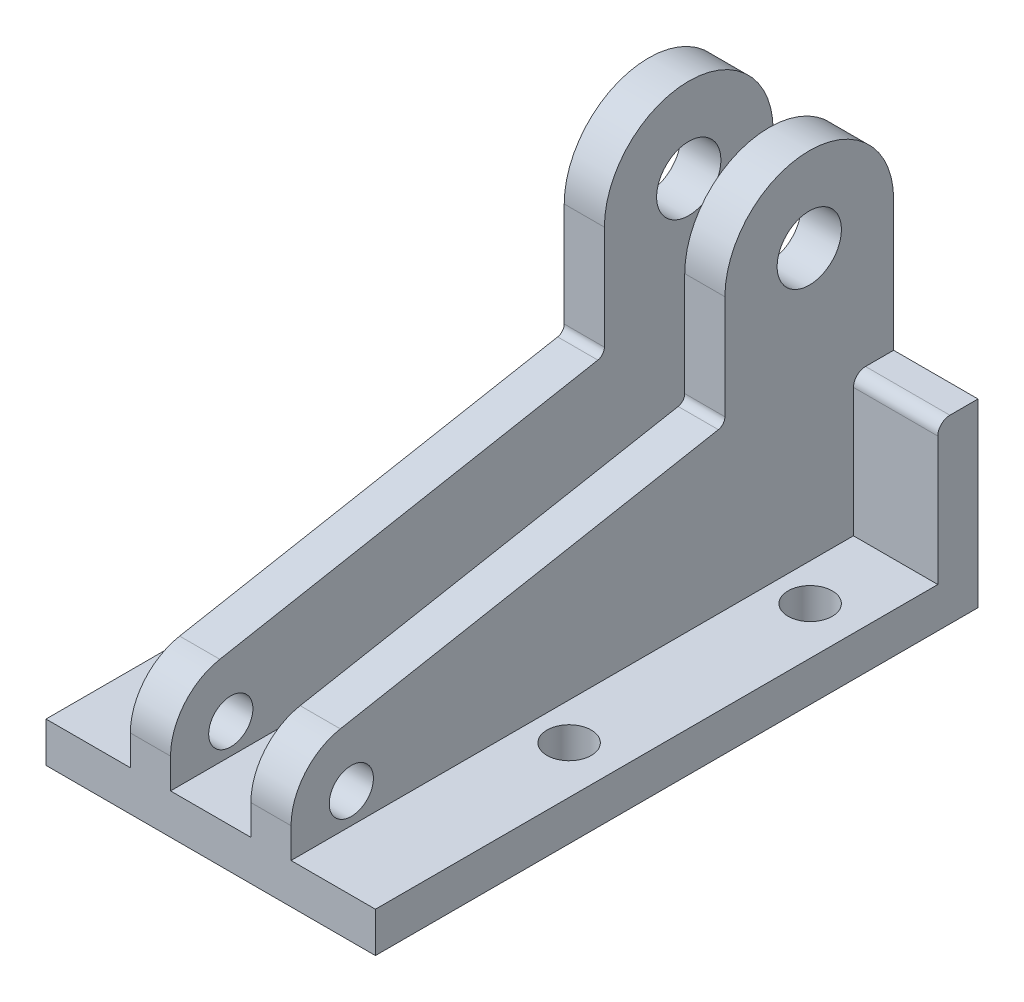
ISO-10303-21;
HEADER;
FILE_DESCRIPTION(('STEP AP214'),'2;1');
FILE_NAME('part.step','',(''),(''),'','','');
FILE_SCHEMA(('AUTOMOTIVE_DESIGN { 1 0 10303 214 1 1 1 1 }'));
ENDSEC;
DATA;
#1=APPLICATION_CONTEXT('core data for automotive mechanical design processes');
#2=APPLICATION_PROTOCOL_DEFINITION('international standard','automotive_design',2000,#1);
#3=PRODUCT_CONTEXT('',#1,'mechanical');
#4=PRODUCT('Part','Part','',(#3));
#5=PRODUCT_RELATED_PRODUCT_CATEGORY('part','',(#4));
#6=PRODUCT_DEFINITION_FORMATION('','',#4);
#7=PRODUCT_DEFINITION_CONTEXT('part definition',#1,'design');
#8=PRODUCT_DEFINITION('design','',#6,#7);
#9=PRODUCT_DEFINITION_SHAPE('','',#8);
#10=(LENGTH_UNIT() NAMED_UNIT(*) SI_UNIT(.MILLI.,.METRE.));
#11=(NAMED_UNIT(*) PLANE_ANGLE_UNIT() SI_UNIT($,.RADIAN.));
#12=(NAMED_UNIT(*) SI_UNIT($,.STERADIAN.) SOLID_ANGLE_UNIT());
#13=UNCERTAINTY_MEASURE_WITH_UNIT(LENGTH_MEASURE(1.E-05),#10,'distance_accuracy_value','');
#14=(GEOMETRIC_REPRESENTATION_CONTEXT(3) GLOBAL_UNCERTAINTY_ASSIGNED_CONTEXT((#13)) GLOBAL_UNIT_ASSIGNED_CONTEXT((#10,
#11,#12)) REPRESENTATION_CONTEXT('',''));
#15=CARTESIAN_POINT('',(0.,0.,0.));
#16=DIRECTION('',(0.,0.,1.));
#17=DIRECTION('',(1.,0.,0.));
#18=AXIS2_PLACEMENT_3D('',#15,#16,#17);
#19=CARTESIAN_POINT('',(-82.,10.,84.297520661157));
#20=DIRECTION('',(0.,1.,0.));
#21=DIRECTION('',(0.,0.,1.));
#22=AXIS2_PLACEMENT_3D('',#19,#20,#21);
#23=PLANE('',#22);
#24=DIRECTION('',(1.,0.,0.));
#25=VECTOR('',#24,1.);
#26=CARTESIAN_POINT('',(-82.,10.,84.297520661157));
#27=LINE('',#26,#25);
#28=CARTESIAN_POINT('',(-82.,10.,84.297520661157));
#29=VERTEX_POINT('',#28);
#30=CARTESIAN_POINT('',(-61.,10.,84.297520661157));
#31=VERTEX_POINT('',#30);
#32=EDGE_CURVE('E11',#29,#31,#27,.T.);
#33=ORIENTED_EDGE('',*,*,#32,.T.);
#34=DIRECTION('',(0.,0.,-1.));
#35=VECTOR('',#34,1.);
#36=CARTESIAN_POINT('',(-61.,10.,84.297520661157));
#37=LINE('',#36,#35);
#38=CARTESIAN_POINT('',(-61.,10.,-55.702479338843));
#39=VERTEX_POINT('',#38);
#40=EDGE_CURVE('E460',#31,#39,#37,.T.);
#41=ORIENTED_EDGE('',*,*,#40,.T.);
#42=DIRECTION('',(1.,0.,0.));
#43=VECTOR('',#42,1.);
#44=CARTESIAN_POINT('',(-82.,10.,-55.702479338843));
#45=LINE('',#44,#43);
#46=CARTESIAN_POINT('',(-82.,10.,-55.702479338843));
#47=VERTEX_POINT('',#46);
#48=EDGE_CURVE('E309',#47,#39,#45,.T.);
#49=ORIENTED_EDGE('',*,*,#48,.F.);
#50=DIRECTION('',(0.,0.,1.));
#51=VECTOR('',#50,1.);
#52=CARTESIAN_POINT('',(-82.,10.,84.297520661157));
#53=LINE('',#52,#51);
#54=EDGE_CURVE('E272',#47,#29,#53,.T.);
#55=ORIENTED_EDGE('',*,*,#54,.T.);
#56=EDGE_LOOP('',(#33,#41,#49,#55));
#57=FACE_BOUND('',#56,.T.);
#58=ADVANCED_FACE('F39',(#57),#23,.T.);
#59=CARTESIAN_POINT('',(-82.,10.,-55.702479338843));
#60=DIRECTION('',(0.,0.,1.));
#61=DIRECTION('',(1.,0.,0.));
#62=AXIS2_PLACEMENT_3D('',#59,#60,#61);
#63=PLANE('',#62);
#64=ORIENTED_EDGE('',*,*,#48,.T.);
#65=DIRECTION('',(0.,1.,0.));
#66=VECTOR('',#65,1.);
#67=CARTESIAN_POINT('',(-61.,10.,-55.702479338843));
#68=LINE('',#67,#66);
#69=CARTESIAN_POINT('',(-61.,42.,-55.702479338843));
#70=VERTEX_POINT('',#69);
#71=EDGE_CURVE('E463',#39,#70,#68,.T.);
#72=ORIENTED_EDGE('',*,*,#71,.T.);
#73=DIRECTION('',(1.,0.,0.));
#74=VECTOR('',#73,1.);
#75=CARTESIAN_POINT('',(-82.,42.,-55.702479338843));
#76=LINE('',#75,#74);
#77=CARTESIAN_POINT('',(-82.,42.,-55.702479338843));
#78=VERTEX_POINT('',#77);
#79=EDGE_CURVE('E313',#78,#70,#76,.T.);
#80=ORIENTED_EDGE('',*,*,#79,.F.);
#81=DIRECTION('',(0.,-1.,0.));
#82=VECTOR('',#81,1.);
#83=CARTESIAN_POINT('',(-82.,10.,-55.702479338843));
#84=LINE('',#83,#82);
#85=EDGE_CURVE('E277',#78,#47,#84,.T.);
#86=ORIENTED_EDGE('',*,*,#85,.T.);
#87=EDGE_LOOP('',(#64,#72,#80,#86));
#88=FACE_BOUND('',#87,.T.);
#89=ADVANCED_FACE('F535',(#88),#63,.T.);
#90=CARTESIAN_POINT('',(-82.,42.,-58.702479338843));
#91=DIRECTION('',(1.,0.,0.));
#92=DIRECTION('',(0.,0.,-1.));
#93=AXIS2_PLACEMENT_3D('',#90,#91,#92);
#94=CYLINDRICAL_SURFACE('',#93,3.);
#95=ORIENTED_EDGE('',*,*,#79,.T.);
#96=CARTESIAN_POINT('',(-61.,42.,-58.702479338843));
#97=DIRECTION('',(-1.,0.,0.));
#98=DIRECTION('',(0.,0.,1.));
#99=AXIS2_PLACEMENT_3D('',#96,#97,#98);
#100=CIRCLE('',#99,3.00000000000002);
#101=CARTESIAN_POINT('',(-61.,45.,-58.702479338843));
#102=VERTEX_POINT('',#101);
#103=EDGE_CURVE('E253',#70,#102,#100,.T.);
#104=ORIENTED_EDGE('',*,*,#103,.T.);
#105=DIRECTION('',(1.,0.,0.));
#106=VECTOR('',#105,1.);
#107=CARTESIAN_POINT('',(-82.,45.,-58.702479338843));
#108=LINE('',#107,#106);
#109=CARTESIAN_POINT('',(-82.,45.,-58.702479338843));
#110=VERTEX_POINT('',#109);
#111=EDGE_CURVE('E266',#110,#102,#108,.T.);
#112=ORIENTED_EDGE('',*,*,#111,.F.);
#113=CARTESIAN_POINT('',(-82.,42.,-58.702479338843));
#114=DIRECTION('',(1.,0.,0.));
#115=DIRECTION('',(0.,0.,-1.));
#116=AXIS2_PLACEMENT_3D('',#113,#114,#115);
#117=CIRCLE('',#116,3.);
#118=EDGE_CURVE('E282',#110,#78,#117,.T.);
#119=ORIENTED_EDGE('',*,*,#118,.T.);
#120=EDGE_LOOP('',(#95,#104,#112,#119));
#121=FACE_BOUND('',#120,.T.);
#122=ADVANCED_FACE('F388',(#121),#94,.T.);
#123=CARTESIAN_POINT('',(-82.,45.,-58.702479338843));
#124=DIRECTION('',(0.,1.,0.));
#125=DIRECTION('',(0.,0.,1.));
#126=AXIS2_PLACEMENT_3D('',#123,#124,#125);
#127=PLANE('',#126);
#128=ORIENTED_EDGE('',*,*,#111,.T.);
#129=DIRECTION('',(0.,0.,-1.));
#130=VECTOR('',#129,1.);
#131=CARTESIAN_POINT('',(-61.,45.,-65.702479338843));
#132=LINE('',#131,#130);
#133=CARTESIAN_POINT('',(-61.,45.,-65.702479338843));
#134=VERTEX_POINT('',#133);
#135=EDGE_CURVE('E395',#102,#134,#132,.T.);
#136=ORIENTED_EDGE('',*,*,#135,.T.);
#137=DIRECTION('',(1.,0.,0.));
#138=VECTOR('',#137,1.);
#139=CARTESIAN_POINT('',(-82.,45.,-65.702479338843));
#140=LINE('',#139,#138);
#141=CARTESIAN_POINT('',(-82.,45.,-65.702479338843));
#142=VERTEX_POINT('',#141);
#143=EDGE_CURVE('E259',#142,#134,#140,.T.);
#144=ORIENTED_EDGE('',*,*,#143,.F.);
#145=DIRECTION('',(0.,0.,1.));
#146=VECTOR('',#145,1.);
#147=CARTESIAN_POINT('',(-82.,45.,-58.702479338843));
#148=LINE('',#147,#146);
#149=EDGE_CURVE('E386',#142,#110,#148,.T.);
#150=ORIENTED_EDGE('',*,*,#149,.T.);
#151=EDGE_LOOP('',(#128,#136,#144,#150));
#152=FACE_BOUND('',#151,.T.);
#153=ADVANCED_FACE('F394',(#152),#127,.T.);
#154=CARTESIAN_POINT('',(-11.7768288178748,10.,24.297520661157));
#155=DIRECTION('',(0.,1.,0.));
#156=DIRECTION('',(0.,0.,1.));
#157=AXIS2_PLACEMENT_3D('',#154,#155,#156);
#158=CIRCLE('',#157,5.5);
#159=CARTESIAN_POINT('',(-11.7768288178748,10.,29.797520661157));
#160=VERTEX_POINT('',#159);
#161=EDGE_CURVE('E963',#160,#160,#158,.T.);
#162=ORIENTED_EDGE('',*,*,#161,.F.);
#163=EDGE_LOOP('',(#162));
#164=FACE_BOUND('',#163,.T.);
#165=CARTESIAN_POINT('',(-11.7768288178748,10.,-35.702479338843));
#166=DIRECTION('',(0.,1.,0.));
#167=DIRECTION('',(0.,0.,1.));
#168=AXIS2_PLACEMENT_3D('',#165,#166,#167);
#169=CIRCLE('',#168,5.5);
#170=CARTESIAN_POINT('',(-11.7768288178748,10.,-30.202479338843));
#171=VERTEX_POINT('',#170);
#172=EDGE_CURVE('E964',#171,#171,#169,.T.);
#173=ORIENTED_EDGE('',*,*,#172,.F.);
#174=EDGE_LOOP('',(#173));
#175=FACE_BOUND('',#174,.T.);
#176=CARTESIAN_POINT('',(-21.,10.,-55.702479338843));
#177=VERTEX_POINT('',#176);
#178=CARTESIAN_POINT('',(0.,10.,-55.702479338843));
#179=VERTEX_POINT('',#178);
#180=EDGE_CURVE('E312',#177,#179,#45,.T.);
#181=ORIENTED_EDGE('',*,*,#180,.F.);
#182=DIRECTION('',(0.,0.,-1.));
#183=VECTOR('',#182,1.);
#184=CARTESIAN_POINT('',(-21.,10.,84.297520661157));
#185=LINE('',#184,#183);
#186=CARTESIAN_POINT('',(-21.,10.,84.297520661157));
#187=VERTEX_POINT('',#186);
#188=EDGE_CURVE('E364',#187,#177,#185,.T.);
#189=ORIENTED_EDGE('',*,*,#188,.F.);
#190=CARTESIAN_POINT('',(0.,10.,84.297520661157));
#191=VERTEX_POINT('',#190);
#192=EDGE_CURVE('E50',#187,#191,#27,.T.);
#193=ORIENTED_EDGE('',*,*,#192,.T.);
#194=DIRECTION('',(0.,0.,1.));
#195=VECTOR('',#194,1.);
#196=CARTESIAN_POINT('',(0.,10.,84.297520661157));
#197=LINE('',#196,#195);
#198=EDGE_CURVE('E305',#179,#191,#197,.T.);
#199=ORIENTED_EDGE('',*,*,#198,.F.);
#200=EDGE_LOOP('',(#181,#189,#193,#199));
#201=FACE_BOUND('',#200,.T.);
#202=ADVANCED_FACE('F537',(#164,#175,#201),#23,.T.);
#203=CARTESIAN_POINT('',(-21.,42.,-55.702479338843));
#204=VERTEX_POINT('',#203);
#205=CARTESIAN_POINT('',(0.,42.,-55.702479338843));
#206=VERTEX_POINT('',#205);
#207=EDGE_CURVE('E316',#204,#206,#76,.T.);
#208=ORIENTED_EDGE('',*,*,#207,.F.);
#209=DIRECTION('',(0.,1.,0.));
#210=VECTOR('',#209,1.);
#211=CARTESIAN_POINT('',(-21.,10.,-55.702479338843));
#212=LINE('',#211,#210);
#213=EDGE_CURVE('E366',#177,#204,#212,.T.);
#214=ORIENTED_EDGE('',*,*,#213,.F.);
#215=ORIENTED_EDGE('',*,*,#180,.T.);
#216=DIRECTION('',(0.,-1.,0.));
#217=VECTOR('',#216,1.);
#218=CARTESIAN_POINT('',(0.,10.,-55.702479338843));
#219=LINE('',#218,#217);
#220=EDGE_CURVE('E302',#206,#179,#219,.T.);
#221=ORIENTED_EDGE('',*,*,#220,.F.);
#222=EDGE_LOOP('',(#208,#214,#215,#221));
#223=FACE_BOUND('',#222,.T.);
#224=ADVANCED_FACE('F543',(#223),#63,.T.);
#225=CARTESIAN_POINT('',(-21.,45.,-58.702479338843));
#226=VERTEX_POINT('',#225);
#227=CARTESIAN_POINT('',(0.,45.,-58.702479338843));
#228=VERTEX_POINT('',#227);
#229=EDGE_CURVE('E263',#226,#228,#108,.T.);
#230=ORIENTED_EDGE('',*,*,#229,.F.);
#231=CARTESIAN_POINT('',(-21.,42.,-58.702479338843));
#232=DIRECTION('',(-1.,0.,0.));
#233=DIRECTION('',(0.,0.,1.));
#234=AXIS2_PLACEMENT_3D('',#231,#232,#233);
#235=CIRCLE('',#234,3.00000000000002);
#236=EDGE_CURVE('E368',#204,#226,#235,.T.);
#237=ORIENTED_EDGE('',*,*,#236,.F.);
#238=ORIENTED_EDGE('',*,*,#207,.T.);
#239=CARTESIAN_POINT('',(0.,42.,-58.702479338843));
#240=DIRECTION('',(1.,0.,0.));
#241=DIRECTION('',(0.,0.,-1.));
#242=AXIS2_PLACEMENT_3D('',#239,#240,#241);
#243=CIRCLE('',#242,3.);
#244=EDGE_CURVE('E299',#228,#206,#243,.T.);
#245=ORIENTED_EDGE('',*,*,#244,.F.);
#246=EDGE_LOOP('',(#230,#237,#238,#245));
#247=FACE_BOUND('',#246,.T.);
#248=ADVANCED_FACE('F334',(#247),#94,.T.);
#249=CARTESIAN_POINT('',(-21.,45.,-65.702479338843));
#250=VERTEX_POINT('',#249);
#251=CARTESIAN_POINT('',(0.,45.,-65.702479338843));
#252=VERTEX_POINT('',#251);
#253=EDGE_CURVE('E260',#250,#252,#140,.T.);
#254=ORIENTED_EDGE('',*,*,#253,.F.);
#255=DIRECTION('',(0.,0.,-1.));
#256=VECTOR('',#255,1.);
#257=CARTESIAN_POINT('',(-21.,45.,-65.702479338843));
#258=LINE('',#257,#256);
#259=EDGE_CURVE('E65',#226,#250,#258,.T.);
#260=ORIENTED_EDGE('',*,*,#259,.F.);
#261=ORIENTED_EDGE('',*,*,#229,.T.);
#262=DIRECTION('',(0.,0.,1.));
#263=VECTOR('',#262,1.);
#264=CARTESIAN_POINT('',(0.,45.,-58.702479338843));
#265=LINE('',#264,#263);
#266=EDGE_CURVE('E296',#252,#228,#265,.T.);
#267=ORIENTED_EDGE('',*,*,#266,.F.);
#268=EDGE_LOOP('',(#254,#260,#261,#267));
#269=FACE_BOUND('',#268,.T.);
#270=ADVANCED_FACE('F333',(#269),#127,.T.);
#271=CARTESIAN_POINT('',(-82.,0.,84.297520661157));
#272=DIRECTION('',(0.,0.,1.));
#273=DIRECTION('',(1.,0.,0.));
#274=AXIS2_PLACEMENT_3D('',#271,#272,#273);
#275=PLANE('',#274);
#276=DIRECTION('',(0.,-1.,0.));
#277=VECTOR('',#276,1.);
#278=CARTESIAN_POINT('',(-31.,10.,84.297520661157));
#279=LINE('',#278,#277);
#280=CARTESIAN_POINT('',(-31.,17.5,84.297520661157));
#281=VERTEX_POINT('',#280);
#282=CARTESIAN_POINT('',(-31.,10.,84.297520661157));
#283=VERTEX_POINT('',#282);
#284=EDGE_CURVE('E419',#281,#283,#279,.T.);
#285=ORIENTED_EDGE('',*,*,#284,.T.);
#286=CARTESIAN_POINT('',(-51.,10.,84.297520661157));
#287=VERTEX_POINT('',#286);
#288=EDGE_CURVE('E48',#287,#283,#27,.T.);
#289=ORIENTED_EDGE('',*,*,#288,.F.);
#290=DIRECTION('',(0.,-1.,0.));
#291=VECTOR('',#290,1.);
#292=CARTESIAN_POINT('',(-51.,10.,84.297520661157));
#293=LINE('',#292,#291);
#294=CARTESIAN_POINT('',(-51.,17.5,84.297520661157));
#295=VERTEX_POINT('',#294);
#296=EDGE_CURVE('E441',#295,#287,#293,.T.);
#297=ORIENTED_EDGE('',*,*,#296,.F.);
#298=DIRECTION('',(-1.,0.,0.));
#299=VECTOR('',#298,1.);
#300=CARTESIAN_POINT('',(-51.,17.5,84.297520661157));
#301=LINE('',#300,#299);
#302=CARTESIAN_POINT('',(-61.,17.5,84.297520661157));
#303=VERTEX_POINT('',#302);
#304=EDGE_CURVE('E467',#295,#303,#301,.T.);
#305=ORIENTED_EDGE('',*,*,#304,.T.);
#306=DIRECTION('',(0.,-1.,0.));
#307=VECTOR('',#306,1.);
#308=CARTESIAN_POINT('',(-61.,10.,84.297520661157));
#309=LINE('',#308,#307);
#310=EDGE_CURVE('E458',#303,#31,#309,.T.);
#311=ORIENTED_EDGE('',*,*,#310,.T.);
#312=ORIENTED_EDGE('',*,*,#32,.F.);
#313=DIRECTION('',(0.,-1.,0.));
#314=VECTOR('',#313,1.);
#315=CARTESIAN_POINT('',(-82.,0.,84.297520661157));
#316=LINE('',#315,#314);
#317=CARTESIAN_POINT('',(-82.,0.,84.297520661157));
#318=VERTEX_POINT('',#317);
#319=EDGE_CURVE('E307',#29,#318,#316,.T.);
#320=ORIENTED_EDGE('',*,*,#319,.T.);
#321=DIRECTION('',(1.,0.,0.));
#322=VECTOR('',#321,1.);
#323=CARTESIAN_POINT('',(-82.,0.,84.297520661157));
#324=LINE('',#323,#322);
#325=CARTESIAN_POINT('',(0.,0.,84.297520661157));
#326=VERTEX_POINT('',#325);
#327=EDGE_CURVE('E43',#318,#326,#324,.T.);
#328=ORIENTED_EDGE('',*,*,#327,.T.);
#329=DIRECTION('',(0.,-1.,0.));
#330=VECTOR('',#329,1.);
#331=CARTESIAN_POINT('',(0.,0.,84.297520661157));
#332=LINE('',#331,#330);
#333=EDGE_CURVE('E286',#191,#326,#332,.T.);
#334=ORIENTED_EDGE('',*,*,#333,.F.);
#335=ORIENTED_EDGE('',*,*,#192,.F.);
#336=DIRECTION('',(0.,-1.,0.));
#337=VECTOR('',#336,1.);
#338=CARTESIAN_POINT('',(-21.,10.,84.297520661157));
#339=LINE('',#338,#337);
#340=CARTESIAN_POINT('',(-21.,17.5,84.297520661157));
#341=VERTEX_POINT('',#340);
#342=EDGE_CURVE('E362',#341,#187,#339,.T.);
#343=ORIENTED_EDGE('',*,*,#342,.F.);
#344=DIRECTION('',(1.,0.,0.));
#345=VECTOR('',#344,1.);
#346=CARTESIAN_POINT('',(-31.,17.5,84.297520661157));
#347=LINE('',#346,#345);
#348=EDGE_CURVE('E290',#281,#341,#347,.T.);
#349=ORIENTED_EDGE('',*,*,#348,.F.);
#350=EDGE_LOOP('',(#285,#289,#297,#305,#311,#312,#320,#328,#334,#335,#343,#349));
#351=FACE_BOUND('',#350,.T.);
#352=ADVANCED_FACE('F41',(#351),#275,.T.);
#353=DIRECTION('',(0.,0.,-1.));
#354=VECTOR('',#353,1.);
#355=CARTESIAN_POINT('',(-51.,10.,84.297520661157));
#356=LINE('',#355,#354);
#357=CARTESIAN_POINT('',(-51.,10.,-55.702479338843));
#358=VERTEX_POINT('',#357);
#359=EDGE_CURVE('E412',#287,#358,#356,.T.);
#360=ORIENTED_EDGE('',*,*,#359,.F.);
#361=ORIENTED_EDGE('',*,*,#288,.T.);
#362=DIRECTION('',(0.,0.,-1.));
#363=VECTOR('',#362,1.);
#364=CARTESIAN_POINT('',(-31.,10.,84.297520661157));
#365=LINE('',#364,#363);
#366=CARTESIAN_POINT('',(-31.,10.,-55.702479338843));
#367=VERTEX_POINT('',#366);
#368=EDGE_CURVE('E411',#283,#367,#365,.T.);
#369=ORIENTED_EDGE('',*,*,#368,.T.);
#370=EDGE_CURVE('E311',#358,#367,#45,.T.);
#371=ORIENTED_EDGE('',*,*,#370,.F.);
#372=EDGE_LOOP('',(#360,#361,#369,#371));
#373=FACE_BOUND('',#372,.T.);
#374=ADVANCED_FACE('F409',(#373),#23,.T.);
#375=DIRECTION('',(0.,1.,0.));
#376=VECTOR('',#375,1.);
#377=CARTESIAN_POINT('',(-51.,10.,-55.702479338843));
#378=LINE('',#377,#376);
#379=CARTESIAN_POINT('',(-51.,42.,-55.702479338843));
#380=VERTEX_POINT('',#379);
#381=EDGE_CURVE('E438',#358,#380,#378,.T.);
#382=ORIENTED_EDGE('',*,*,#381,.F.);
#383=ORIENTED_EDGE('',*,*,#370,.T.);
#384=DIRECTION('',(0.,1.,0.));
#385=VECTOR('',#384,1.);
#386=CARTESIAN_POINT('',(-31.,10.,-55.702479338843));
#387=LINE('',#386,#385);
#388=CARTESIAN_POINT('',(-31.,42.,-55.702479338843));
#389=VERTEX_POINT('',#388);
#390=EDGE_CURVE('E423',#367,#389,#387,.T.);
#391=ORIENTED_EDGE('',*,*,#390,.T.);
#392=EDGE_CURVE('E315',#380,#389,#76,.T.);
#393=ORIENTED_EDGE('',*,*,#392,.F.);
#394=EDGE_LOOP('',(#382,#383,#391,#393));
#395=FACE_BOUND('',#394,.T.);
#396=ADVANCED_FACE('F437',(#395),#63,.T.);
#397=CARTESIAN_POINT('',(-51.,42.,-58.702479338843));
#398=DIRECTION('',(-1.,0.,0.));
#399=DIRECTION('',(0.,0.,1.));
#400=AXIS2_PLACEMENT_3D('',#397,#398,#399);
#401=CIRCLE('',#400,3.00000000000002);
#402=CARTESIAN_POINT('',(-51.,45.,-58.702479338843));
#403=VERTEX_POINT('',#402);
#404=EDGE_CURVE('E250',#380,#403,#401,.T.);
#405=ORIENTED_EDGE('',*,*,#404,.F.);
#406=ORIENTED_EDGE('',*,*,#392,.T.);
#407=CARTESIAN_POINT('',(-31.,42.,-58.702479338843));
#408=DIRECTION('',(-1.,0.,0.));
#409=DIRECTION('',(0.,0.,1.));
#410=AXIS2_PLACEMENT_3D('',#407,#408,#409);
#411=CIRCLE('',#410,3.00000000000002);
#412=CARTESIAN_POINT('',(-31.,45.,-58.702479338843));
#413=VERTEX_POINT('',#412);
#414=EDGE_CURVE('E380',#389,#413,#411,.T.);
#415=ORIENTED_EDGE('',*,*,#414,.T.);
#416=EDGE_CURVE('E326',#403,#413,#108,.T.);
#417=ORIENTED_EDGE('',*,*,#416,.F.);
#418=EDGE_LOOP('',(#405,#406,#415,#417));
#419=FACE_BOUND('',#418,.T.);
#420=ADVANCED_FACE('F433',(#419),#94,.T.);
#421=DIRECTION('',(0.,0.,-1.));
#422=VECTOR('',#421,1.);
#423=CARTESIAN_POINT('',(-51.,45.,-65.702479338843));
#424=LINE('',#423,#422);
#425=CARTESIAN_POINT('',(-51.,45.,-65.702479338843));
#426=VERTEX_POINT('',#425);
#427=EDGE_CURVE('E245',#403,#426,#424,.T.);
#428=ORIENTED_EDGE('',*,*,#427,.F.);
#429=ORIENTED_EDGE('',*,*,#416,.T.);
#430=DIRECTION('',(0.,0.,-1.));
#431=VECTOR('',#430,1.);
#432=CARTESIAN_POINT('',(-31.,45.,-65.702479338843));
#433=LINE('',#432,#431);
#434=CARTESIAN_POINT('',(-31.,45.,-65.702479338843));
#435=VERTEX_POINT('',#434);
#436=EDGE_CURVE('E258',#413,#435,#433,.T.);
#437=ORIENTED_EDGE('',*,*,#436,.T.);
#438=EDGE_CURVE('E239',#426,#435,#140,.T.);
#439=ORIENTED_EDGE('',*,*,#438,.F.);
#440=EDGE_LOOP('',(#428,#429,#437,#439));
#441=FACE_BOUND('',#440,.T.);
#442=ADVANCED_FACE('F256',(#441),#127,.T.);
#443=CARTESIAN_POINT('',(-82.,0.,-65.702479338843));
#444=DIRECTION('',(0.,0.,-1.));
#445=DIRECTION('',(-1.,0.,0.));
#446=AXIS2_PLACEMENT_3D('',#443,#444,#445);
#447=PLANE('',#446);
#448=DIRECTION('',(0.,1.,0.));
#449=VECTOR('',#448,1.);
#450=CARTESIAN_POINT('',(-21.,45.,-65.702479338843));
#451=LINE('',#450,#449);
#452=CARTESIAN_POINT('',(-21.,77.5313941212426,-65.702479338843));
#453=VERTEX_POINT('',#452);
#454=EDGE_CURVE('E339',#250,#453,#451,.T.);
#455=ORIENTED_EDGE('',*,*,#454,.F.);
#456=ORIENTED_EDGE('',*,*,#253,.T.);
#457=DIRECTION('',(0.,1.,0.));
#458=VECTOR('',#457,1.);
#459=CARTESIAN_POINT('',(0.,0.,-65.702479338843));
#460=LINE('',#459,#458);
#461=CARTESIAN_POINT('',(0.,0.,-65.702479338843));
#462=VERTEX_POINT('',#461);
#463=EDGE_CURVE('E293',#462,#252,#460,.T.);
#464=ORIENTED_EDGE('',*,*,#463,.F.);
#465=DIRECTION('',(1.,0.,0.));
#466=VECTOR('',#465,1.);
#467=CARTESIAN_POINT('',(-82.,0.,-65.702479338843));
#468=LINE('',#467,#466);
#469=CARTESIAN_POINT('',(-82.,0.,-65.702479338843));
#470=VERTEX_POINT('',#469);
#471=EDGE_CURVE('E264',#470,#462,#468,.T.);
#472=ORIENTED_EDGE('',*,*,#471,.F.);
#473=DIRECTION('',(0.,1.,0.));
#474=VECTOR('',#473,1.);
#475=CARTESIAN_POINT('',(-82.,0.,-65.702479338843));
#476=LINE('',#475,#474);
#477=EDGE_CURVE('E384',#470,#142,#476,.T.);
#478=ORIENTED_EDGE('',*,*,#477,.T.);
#479=ORIENTED_EDGE('',*,*,#143,.T.);
#480=DIRECTION('',(0.,1.,0.));
#481=VECTOR('',#480,1.);
#482=CARTESIAN_POINT('',(-61.,45.,-65.702479338843));
#483=LINE('',#482,#481);
#484=CARTESIAN_POINT('',(-61.,77.5313941212426,-65.702479338843));
#485=VERTEX_POINT('',#484);
#486=EDGE_CURVE('E57',#134,#485,#483,.T.);
#487=ORIENTED_EDGE('',*,*,#486,.T.);
#488=DIRECTION('',(-1.,0.,0.));
#489=VECTOR('',#488,1.);
#490=CARTESIAN_POINT('',(-51.,77.5313941212426,-65.702479338843));
#491=LINE('',#490,#489);
#492=CARTESIAN_POINT('',(-51.,77.5313941212426,-65.702479338843));
#493=VERTEX_POINT('',#492);
#494=EDGE_CURVE('E242',#493,#485,#491,.T.);
#495=ORIENTED_EDGE('',*,*,#494,.F.);
#496=DIRECTION('',(0.,1.,0.));
#497=VECTOR('',#496,1.);
#498=CARTESIAN_POINT('',(-51.,45.,-65.702479338843));
#499=LINE('',#498,#497);
#500=EDGE_CURVE('E234',#426,#493,#499,.T.);
#501=ORIENTED_EDGE('',*,*,#500,.F.);
#502=ORIENTED_EDGE('',*,*,#438,.T.);
#503=DIRECTION('',(0.,1.,0.));
#504=VECTOR('',#503,1.);
#505=CARTESIAN_POINT('',(-31.,45.,-65.702479338843));
#506=LINE('',#505,#504);
#507=CARTESIAN_POINT('',(-31.,77.5313941212426,-65.702479338843));
#508=VERTEX_POINT('',#507);
#509=EDGE_CURVE('E495',#435,#508,#506,.T.);
#510=ORIENTED_EDGE('',*,*,#509,.T.);
#511=DIRECTION('',(1.,0.,0.));
#512=VECTOR('',#511,1.);
#513=CARTESIAN_POINT('',(-31.,77.5313941212426,-65.702479338843));
#514=LINE('',#513,#512);
#515=EDGE_CURVE('E340',#508,#453,#514,.T.);
#516=ORIENTED_EDGE('',*,*,#515,.T.);
#517=EDGE_LOOP('',(#455,#456,#464,#472,#478,#479,#487,#495,#501,#502,#510,#516));
#518=FACE_BOUND('',#517,.T.);
#519=ADVANCED_FACE('F236',(#518),#447,.T.);
#520=CARTESIAN_POINT('',(-82.,0.,84.297520661157));
#521=DIRECTION('',(0.,-1.,0.));
#522=DIRECTION('',(0.,0.,-1.));
#523=AXIS2_PLACEMENT_3D('',#520,#521,#522);
#524=PLANE('',#523);
#525=CARTESIAN_POINT('',(-11.7768288178748,0.,24.297520661157));
#526=DIRECTION('',(0.,1.,0.));
#527=DIRECTION('',(0.,0.,1.));
#528=AXIS2_PLACEMENT_3D('',#525,#526,#527);
#529=CIRCLE('',#528,5.5);
#530=CARTESIAN_POINT('',(-11.7768288178748,0.,29.797520661157));
#531=VERTEX_POINT('',#530);
#532=EDGE_CURVE('E960',#531,#531,#529,.T.);
#533=ORIENTED_EDGE('',*,*,#532,.T.);
#534=EDGE_LOOP('',(#533));
#535=FACE_BOUND('',#534,.T.);
#536=CARTESIAN_POINT('',(-11.7768288178748,0.,-35.702479338843));
#537=DIRECTION('',(0.,1.,0.));
#538=DIRECTION('',(0.,0.,1.));
#539=AXIS2_PLACEMENT_3D('',#536,#537,#538);
#540=CIRCLE('',#539,5.5);
#541=CARTESIAN_POINT('',(-11.7768288178748,0.,-30.202479338843));
#542=VERTEX_POINT('',#541);
#543=EDGE_CURVE('E969',#542,#542,#540,.T.);
#544=ORIENTED_EDGE('',*,*,#543,.T.);
#545=EDGE_LOOP('',(#544));
#546=FACE_BOUND('',#545,.T.);
#547=DIRECTION('',(0.,0.,-1.));
#548=VECTOR('',#547,1.);
#549=CARTESIAN_POINT('',(0.,0.,84.297520661157));
#550=LINE('',#549,#548);
#551=EDGE_CURVE('E289',#326,#462,#550,.T.);
#552=ORIENTED_EDGE('',*,*,#551,.F.);
#553=ORIENTED_EDGE('',*,*,#327,.F.);
#554=DIRECTION('',(0.,0.,-1.));
#555=VECTOR('',#554,1.);
#556=CARTESIAN_POINT('',(-82.,0.,84.297520661157));
#557=LINE('',#556,#555);
#558=EDGE_CURVE('E382',#318,#470,#557,.T.);
#559=ORIENTED_EDGE('',*,*,#558,.T.);
#560=ORIENTED_EDGE('',*,*,#471,.T.);
#561=EDGE_LOOP('',(#552,#553,#559,#560));
#562=FACE_BOUND('',#561,.T.);
#563=ADVANCED_FACE('F397',(#535,#546,#562),#524,.T.);
#564=CARTESIAN_POINT('',(-82.,42.,-58.702479338843));
#565=DIRECTION('',(1.,0.,0.));
#566=DIRECTION('',(0.,0.,-1.));
#567=AXIS2_PLACEMENT_3D('',#564,#565,#566);
#568=PLANE('',#567);
#569=ORIENTED_EDGE('',*,*,#319,.F.);
#570=ORIENTED_EDGE('',*,*,#54,.F.);
#571=ORIENTED_EDGE('',*,*,#85,.F.);
#572=ORIENTED_EDGE('',*,*,#118,.F.);
#573=ORIENTED_EDGE('',*,*,#149,.F.);
#574=ORIENTED_EDGE('',*,*,#477,.F.);
#575=ORIENTED_EDGE('',*,*,#558,.F.);
#576=EDGE_LOOP('',(#569,#570,#571,#572,#573,#574,#575));
#577=FACE_BOUND('',#576,.T.);
#578=ADVANCED_FACE('F393',(#577),#568,.F.);
#579=CARTESIAN_POINT('',(0.,42.,-58.702479338843));
#580=DIRECTION('',(1.,0.,0.));
#581=DIRECTION('',(0.,0.,-1.));
#582=AXIS2_PLACEMENT_3D('',#579,#580,#581);
#583=PLANE('',#582);
#584=ORIENTED_EDGE('',*,*,#333,.T.);
#585=ORIENTED_EDGE('',*,*,#551,.T.);
#586=ORIENTED_EDGE('',*,*,#463,.T.);
#587=ORIENTED_EDGE('',*,*,#266,.T.);
#588=ORIENTED_EDGE('',*,*,#244,.T.);
#589=ORIENTED_EDGE('',*,*,#220,.T.);
#590=ORIENTED_EDGE('',*,*,#198,.T.);
#591=EDGE_LOOP('',(#584,#585,#586,#587,#588,#589,#590));
#592=FACE_BOUND('',#591,.T.);
#593=ADVANCED_FACE('F336',(#592),#583,.T.);
#594=CARTESIAN_POINT('',(-31.,17.5,69.297520661157));
#595=DIRECTION('',(1.,0.,0.));
#596=DIRECTION('',(0.,0.,-1.));
#597=AXIS2_PLACEMENT_3D('',#594,#595,#596);
#598=CYLINDRICAL_SURFACE('',#597,15.);
#599=CARTESIAN_POINT('',(-21.,17.5,69.297520661157));
#600=DIRECTION('',(1.,0.,0.));
#601=DIRECTION('',(0.,0.,-1.));
#602=AXIS2_PLACEMENT_3D('',#599,#600,#601);
#603=CIRCLE('',#602,15.);
#604=CARTESIAN_POINT('',(-21.,32.248602317951,72.0322472776453));
#605=VERTEX_POINT('',#604);
#606=EDGE_CURVE('E359',#605,#341,#603,.T.);
#607=ORIENTED_EDGE('',*,*,#606,.F.);
#608=DIRECTION('',(1.,0.,0.));
#609=VECTOR('',#608,1.);
#610=CARTESIAN_POINT('',(-31.,32.248602317951,72.0322472776453));
#611=LINE('',#610,#609);
#612=CARTESIAN_POINT('',(-31.,32.248602317951,72.0322472776453));
#613=VERTEX_POINT('',#612);
#614=EDGE_CURVE('E371',#613,#605,#611,.T.);
#615=ORIENTED_EDGE('',*,*,#614,.F.);
#616=CARTESIAN_POINT('',(-31.,17.5,69.297520661157));
#617=DIRECTION('',(1.,0.,0.));
#618=DIRECTION('',(0.,0.,-1.));
#619=AXIS2_PLACEMENT_3D('',#616,#617,#618);
#620=CIRCLE('',#619,15.);
#621=EDGE_CURVE('E425',#613,#281,#620,.T.);
#622=ORIENTED_EDGE('',*,*,#621,.T.);
#623=ORIENTED_EDGE('',*,*,#348,.T.);
#624=EDGE_LOOP('',(#607,#615,#622,#623));
#625=FACE_BOUND('',#624,.T.);
#626=ADVANCED_FACE('F524',(#625),#598,.T.);
#627=CARTESIAN_POINT('',(-31.,32.248602317951,72.0322472776453));
#628=DIRECTION('',(0.,0.983240154530069,0.182315107765884));
#629=DIRECTION('',(0.,-0.182315107765884,0.983240154530069));
#630=AXIS2_PLACEMENT_3D('',#627,#628,#629);
#631=PLANE('',#630);
#632=DIRECTION('',(0.,-0.182315107765884,0.983240154530069));
#633=VECTOR('',#632,1.);
#634=CARTESIAN_POINT('',(-21.,32.248602317951,72.0322472776453));
#635=LINE('',#634,#633);
#636=CARTESIAN_POINT('',(-21.,49.6967652133421,-22.0671095543747));
#637=VERTEX_POINT('',#636);
#638=EDGE_CURVE('E356',#637,#605,#635,.T.);
#639=ORIENTED_EDGE('',*,*,#638,.F.);
#640=DIRECTION('',(1.,0.,0.));
#641=VECTOR('',#640,1.);
#642=CARTESIAN_POINT('',(-31.,49.6967652133421,-22.0671095543747));
#643=LINE('',#642,#641);
#644=CARTESIAN_POINT('',(-31.,49.6967652133421,-22.0671095543747));
#645=VERTEX_POINT('',#644);
#646=EDGE_CURVE('E373',#645,#637,#643,.T.);
#647=ORIENTED_EDGE('',*,*,#646,.F.);
#648=DIRECTION('',(0.,-0.182315107765884,0.983240154530069));
#649=VECTOR('',#648,1.);
#650=CARTESIAN_POINT('',(-31.,32.248602317951,72.0322472776453));
#651=LINE('',#650,#649);
#652=EDGE_CURVE('E427',#645,#613,#651,.T.);
#653=ORIENTED_EDGE('',*,*,#652,.T.);
#654=ORIENTED_EDGE('',*,*,#614,.T.);
#655=EDGE_LOOP('',(#639,#647,#653,#654));
#656=FACE_BOUND('',#655,.T.);
#657=ADVANCED_FACE('F509',(#656),#631,.T.);
#658=CARTESIAN_POINT('',(-31.,51.6632455224022,-21.702479338843));
#659=DIRECTION('',(1.,0.,0.));
#660=DIRECTION('',(0.,0.,-1.));
#661=AXIS2_PLACEMENT_3D('',#658,#659,#660);
#662=CYLINDRICAL_SURFACE('',#661,2.);
#663=CARTESIAN_POINT('',(-21.,51.6632455224022,-21.702479338843));
#664=DIRECTION('',(-1.,0.,0.));
#665=DIRECTION('',(0.,0.,1.));
#666=AXIS2_PLACEMENT_3D('',#663,#664,#665);
#667=CIRCLE('',#666,2.);
#668=CARTESIAN_POINT('',(-21.,51.6632455224022,-23.702479338843));
#669=VERTEX_POINT('',#668);
#670=EDGE_CURVE('E353',#669,#637,#667,.T.);
#671=ORIENTED_EDGE('',*,*,#670,.F.);
#672=DIRECTION('',(1.,0.,0.));
#673=VECTOR('',#672,1.);
#674=CARTESIAN_POINT('',(-31.,51.6632455224022,-23.702479338843));
#675=LINE('',#674,#673);
#676=CARTESIAN_POINT('',(-31.,51.6632455224022,-23.702479338843));
#677=VERTEX_POINT('',#676);
#678=EDGE_CURVE('E375',#677,#669,#675,.T.);
#679=ORIENTED_EDGE('',*,*,#678,.F.);
#680=CARTESIAN_POINT('',(-31.,51.6632455224022,-21.702479338843));
#681=DIRECTION('',(-1.,0.,0.));
#682=DIRECTION('',(0.,0.,1.));
#683=AXIS2_PLACEMENT_3D('',#680,#681,#682);
#684=CIRCLE('',#683,2.);
#685=EDGE_CURVE('E503',#677,#645,#684,.T.);
#686=ORIENTED_EDGE('',*,*,#685,.T.);
#687=ORIENTED_EDGE('',*,*,#646,.T.);
#688=EDGE_LOOP('',(#671,#679,#686,#687));
#689=FACE_BOUND('',#688,.T.);
#690=ADVANCED_FACE('F515',(#689),#662,.F.);
#691=CARTESIAN_POINT('',(-31.,77.5313941212426,-23.702479338843));
#692=DIRECTION('',(0.,0.,1.));
#693=DIRECTION('',(0.,-1.,0.));
#694=AXIS2_PLACEMENT_3D('',#691,#692,#693);
#695=PLANE('',#694);
#696=DIRECTION('',(0.,-1.,0.));
#697=VECTOR('',#696,1.);
#698=CARTESIAN_POINT('',(-21.,77.5313941212426,-23.702479338843));
#699=LINE('',#698,#697);
#700=CARTESIAN_POINT('',(-21.,77.5313941212426,-23.702479338843));
#701=VERTEX_POINT('',#700);
#702=EDGE_CURVE('E345',#701,#669,#699,.T.);
#703=ORIENTED_EDGE('',*,*,#702,.F.);
#704=DIRECTION('',(1.,0.,0.));
#705=VECTOR('',#704,1.);
#706=CARTESIAN_POINT('',(-31.,77.5313941212426,-23.702479338843));
#707=LINE('',#706,#705);
#708=CARTESIAN_POINT('',(-31.,77.5313941212426,-23.702479338843));
#709=VERTEX_POINT('',#708);
#710=EDGE_CURVE('E377',#709,#701,#707,.T.);
#711=ORIENTED_EDGE('',*,*,#710,.F.);
#712=DIRECTION('',(0.,-1.,0.));
#713=VECTOR('',#712,1.);
#714=CARTESIAN_POINT('',(-31.,77.5313941212426,-23.702479338843));
#715=LINE('',#714,#713);
#716=EDGE_CURVE('E500',#709,#677,#715,.T.);
#717=ORIENTED_EDGE('',*,*,#716,.T.);
#718=ORIENTED_EDGE('',*,*,#678,.T.);
#719=EDGE_LOOP('',(#703,#711,#717,#718));
#720=FACE_BOUND('',#719,.T.);
#721=ADVANCED_FACE('F518',(#720),#695,.T.);
#722=CARTESIAN_POINT('',(-31.,77.5313941212426,-44.702479338843));
#723=DIRECTION('',(1.,0.,0.));
#724=DIRECTION('',(0.,0.,-1.));
#725=AXIS2_PLACEMENT_3D('',#722,#723,#724);
#726=CYLINDRICAL_SURFACE('',#725,21.);
#727=CARTESIAN_POINT('',(-21.,77.5313941212426,-44.702479338843));
#728=DIRECTION('',(1.,0.,0.));
#729=DIRECTION('',(0.,0.,-1.));
#730=AXIS2_PLACEMENT_3D('',#727,#728,#729);
#731=CIRCLE('',#730,21.);
#732=EDGE_CURVE('E343',#453,#701,#731,.T.);
#733=ORIENTED_EDGE('',*,*,#732,.F.);
#734=ORIENTED_EDGE('',*,*,#515,.F.);
#735=CARTESIAN_POINT('',(-31.,77.5313941212426,-44.702479338843));
#736=DIRECTION('',(1.,0.,0.));
#737=DIRECTION('',(0.,0.,-1.));
#738=AXIS2_PLACEMENT_3D('',#735,#736,#737);
#739=CIRCLE('',#738,21.);
#740=EDGE_CURVE('E497',#508,#709,#739,.T.);
#741=ORIENTED_EDGE('',*,*,#740,.T.);
#742=ORIENTED_EDGE('',*,*,#710,.T.);
#743=EDGE_LOOP('',(#733,#734,#741,#742));
#744=FACE_BOUND('',#743,.T.);
#745=ADVANCED_FACE('F521',(#744),#726,.T.);
#746=CARTESIAN_POINT('',(-31.,42.,-58.702479338843));
#747=DIRECTION('',(-1.,0.,0.));
#748=DIRECTION('',(0.,0.,1.));
#749=AXIS2_PLACEMENT_3D('',#746,#747,#748);
#750=PLANE('',#749);
#751=CARTESIAN_POINT('',(-31.,77.5313941212426,-44.702479338843));
#752=DIRECTION('',(1.,0.,0.));
#753=DIRECTION('',(0.,0.,-1.));
#754=AXIS2_PLACEMENT_3D('',#751,#752,#753);
#755=CIRCLE('',#754,8.);
#756=CARTESIAN_POINT('',(-31.,77.5313941212426,-52.702479338843));
#757=VERTEX_POINT('',#756);
#758=EDGE_CURVE('E484',#757,#757,#755,.T.);
#759=ORIENTED_EDGE('',*,*,#758,.T.);
#760=EDGE_LOOP('',(#759));
#761=FACE_BOUND('',#760,.T.);
#762=CARTESIAN_POINT('',(-31.,17.5,69.297520661157));
#763=DIRECTION('',(1.,0.,0.));
#764=DIRECTION('',(0.,0.,-1.));
#765=AXIS2_PLACEMENT_3D('',#762,#763,#764);
#766=CIRCLE('',#765,5.5);
#767=CARTESIAN_POINT('',(-31.,17.5,63.797520661157));
#768=VERTEX_POINT('',#767);
#769=EDGE_CURVE('E347',#768,#768,#766,.T.);
#770=ORIENTED_EDGE('',*,*,#769,.T.);
#771=EDGE_LOOP('',(#770));
#772=FACE_BOUND('',#771,.T.);
#773=ORIENTED_EDGE('',*,*,#436,.F.);
#774=ORIENTED_EDGE('',*,*,#414,.F.);
#775=ORIENTED_EDGE('',*,*,#390,.F.);
#776=ORIENTED_EDGE('',*,*,#368,.F.);
#777=ORIENTED_EDGE('',*,*,#284,.F.);
#778=ORIENTED_EDGE('',*,*,#621,.F.);
#779=ORIENTED_EDGE('',*,*,#652,.F.);
#780=ORIENTED_EDGE('',*,*,#685,.F.);
#781=ORIENTED_EDGE('',*,*,#716,.F.);
#782=ORIENTED_EDGE('',*,*,#740,.F.);
#783=ORIENTED_EDGE('',*,*,#509,.F.);
#784=EDGE_LOOP('',(#773,#774,#775,#776,#777,#778,#779,#780,#781,#782,#783));
#785=FACE_BOUND('',#784,.T.);
#786=ADVANCED_FACE('F417',(#761,#772,#785),#750,.T.);
#787=CARTESIAN_POINT('',(-21.,42.,-58.702479338843));
#788=DIRECTION('',(-1.,0.,0.));
#789=DIRECTION('',(0.,0.,1.));
#790=AXIS2_PLACEMENT_3D('',#787,#788,#789);
#791=PLANE('',#790);
#792=CARTESIAN_POINT('',(-21.,77.5313941212426,-44.702479338843));
#793=DIRECTION('',(1.,0.,0.));
#794=DIRECTION('',(0.,0.,-1.));
#795=AXIS2_PLACEMENT_3D('',#792,#793,#794);
#796=CIRCLE('',#795,8.);
#797=CARTESIAN_POINT('',(-21.,77.5313941212426,-52.702479338843));
#798=VERTEX_POINT('',#797);
#799=EDGE_CURVE('E470',#798,#798,#796,.T.);
#800=ORIENTED_EDGE('',*,*,#799,.F.);
#801=EDGE_LOOP('',(#800));
#802=FACE_BOUND('',#801,.T.);
#803=CARTESIAN_POINT('',(-21.,17.5,69.297520661157));
#804=DIRECTION('',(1.,0.,0.));
#805=DIRECTION('',(0.,0.,-1.));
#806=AXIS2_PLACEMENT_3D('',#803,#804,#805);
#807=CIRCLE('',#806,5.5);
#808=CARTESIAN_POINT('',(-21.,17.5,63.797520661157));
#809=VERTEX_POINT('',#808);
#810=EDGE_CURVE('E487',#809,#809,#807,.T.);
#811=ORIENTED_EDGE('',*,*,#810,.F.);
#812=EDGE_LOOP('',(#811));
#813=FACE_BOUND('',#812,.T.);
#814=ORIENTED_EDGE('',*,*,#259,.T.);
#815=ORIENTED_EDGE('',*,*,#454,.T.);
#816=ORIENTED_EDGE('',*,*,#732,.T.);
#817=ORIENTED_EDGE('',*,*,#702,.T.);
#818=ORIENTED_EDGE('',*,*,#670,.T.);
#819=ORIENTED_EDGE('',*,*,#638,.T.);
#820=ORIENTED_EDGE('',*,*,#606,.T.);
#821=ORIENTED_EDGE('',*,*,#342,.T.);
#822=ORIENTED_EDGE('',*,*,#188,.T.);
#823=ORIENTED_EDGE('',*,*,#213,.T.);
#824=ORIENTED_EDGE('',*,*,#236,.T.);
#825=EDGE_LOOP('',(#814,#815,#816,#817,#818,#819,#820,#821,#822,#823,#824));
#826=FACE_BOUND('',#825,.T.);
#827=ADVANCED_FACE('F522',(#802,#813,#826),#791,.F.);
#828=CARTESIAN_POINT('',(-31.,17.5,69.297520661157));
#829=DIRECTION('',(1.,0.,0.));
#830=DIRECTION('',(0.,0.,-1.));
#831=AXIS2_PLACEMENT_3D('',#828,#829,#830);
#832=CYLINDRICAL_SURFACE('',#831,5.5);
#833=ORIENTED_EDGE('',*,*,#769,.F.);
#834=EDGE_LOOP('',(#833));
#835=FACE_BOUND('',#834,.T.);
#836=ORIENTED_EDGE('',*,*,#810,.T.);
#837=EDGE_LOOP('',(#836));
#838=FACE_BOUND('',#837,.T.);
#839=ADVANCED_FACE('F612',(#835,#838),#832,.F.);
#840=CARTESIAN_POINT('',(-31.,77.5313941212426,-44.702479338843));
#841=DIRECTION('',(1.,0.,0.));
#842=DIRECTION('',(0.,0.,-1.));
#843=AXIS2_PLACEMENT_3D('',#840,#841,#842);
#844=CYLINDRICAL_SURFACE('',#843,8.);
#845=ORIENTED_EDGE('',*,*,#758,.F.);
#846=EDGE_LOOP('',(#845));
#847=FACE_BOUND('',#846,.T.);
#848=ORIENTED_EDGE('',*,*,#799,.T.);
#849=EDGE_LOOP('',(#848));
#850=FACE_BOUND('',#849,.T.);
#851=ADVANCED_FACE('F606',(#847,#850),#844,.F.);
#852=CARTESIAN_POINT('',(-51.,17.5,69.297520661157));
#853=DIRECTION('',(-1.,0.,0.));
#854=DIRECTION('',(0.,0.,-1.));
#855=AXIS2_PLACEMENT_3D('',#852,#853,#854);
#856=CYLINDRICAL_SURFACE('',#855,15.);
#857=CARTESIAN_POINT('',(-61.,17.5,69.297520661157));
#858=DIRECTION('',(1.,0.,0.));
#859=DIRECTION('',(0.,0.,-1.));
#860=AXIS2_PLACEMENT_3D('',#857,#858,#859);
#861=CIRCLE('',#860,15.);
#862=CARTESIAN_POINT('',(-61.,32.248602317951,72.0322472776453));
#863=VERTEX_POINT('',#862);
#864=EDGE_CURVE('E456',#863,#303,#861,.T.);
#865=ORIENTED_EDGE('',*,*,#864,.T.);
#866=ORIENTED_EDGE('',*,*,#304,.F.);
#867=CARTESIAN_POINT('',(-51.,17.5,69.297520661157));
#868=DIRECTION('',(1.,0.,0.));
#869=DIRECTION('',(0.,0.,-1.));
#870=AXIS2_PLACEMENT_3D('',#867,#868,#869);
#871=CIRCLE('',#870,15.);
#872=CARTESIAN_POINT('',(-51.,32.248602317951,72.0322472776453));
#873=VERTEX_POINT('',#872);
#874=EDGE_CURVE('E991',#873,#295,#871,.T.);
#875=ORIENTED_EDGE('',*,*,#874,.F.);
#876=DIRECTION('',(-1.,0.,0.));
#877=VECTOR('',#876,1.);
#878=CARTESIAN_POINT('',(-51.,32.248602317951,72.0322472776453));
#879=LINE('',#878,#877);
#880=EDGE_CURVE('E471',#873,#863,#879,.T.);
#881=ORIENTED_EDGE('',*,*,#880,.T.);
#882=EDGE_LOOP('',(#865,#866,#875,#881));
#883=FACE_BOUND('',#882,.T.);
#884=ADVANCED_FACE('F611',(#883),#856,.T.);
#885=CARTESIAN_POINT('',(-51.,32.248602317951,72.0322472776453));
#886=DIRECTION('',(0.,0.983240154530069,0.182315107765884));
#887=DIRECTION('',(0.,-0.182315107765884,0.983240154530069));
#888=AXIS2_PLACEMENT_3D('',#885,#886,#887);
#889=PLANE('',#888);
#890=DIRECTION('',(0.,-0.182315107765884,0.983240154530069));
#891=VECTOR('',#890,1.);
#892=CARTESIAN_POINT('',(-61.,32.248602317951,72.0322472776453));
#893=LINE('',#892,#891);
#894=CARTESIAN_POINT('',(-61.,49.6967652133421,-22.0671095543747));
#895=VERTEX_POINT('',#894);
#896=EDGE_CURVE('E454',#895,#863,#893,.T.);
#897=ORIENTED_EDGE('',*,*,#896,.T.);
#898=ORIENTED_EDGE('',*,*,#880,.F.);
#899=DIRECTION('',(0.,-0.182315107765884,0.983240154530069));
#900=VECTOR('',#899,1.);
#901=CARTESIAN_POINT('',(-51.,32.248602317951,72.0322472776453));
#902=LINE('',#901,#900);
#903=CARTESIAN_POINT('',(-51.,49.6967652133421,-22.0671095543747));
#904=VERTEX_POINT('',#903);
#905=EDGE_CURVE('E989',#904,#873,#902,.T.);
#906=ORIENTED_EDGE('',*,*,#905,.F.);
#907=DIRECTION('',(-1.,0.,0.));
#908=VECTOR('',#907,1.);
#909=CARTESIAN_POINT('',(-51.,49.6967652133421,-22.0671095543747));
#910=LINE('',#909,#908);
#911=EDGE_CURVE('E474',#904,#895,#910,.T.);
#912=ORIENTED_EDGE('',*,*,#911,.T.);
#913=EDGE_LOOP('',(#897,#898,#906,#912));
#914=FACE_BOUND('',#913,.T.);
#915=ADVANCED_FACE('F688',(#914),#889,.T.);
#916=CARTESIAN_POINT('',(-51.,51.6632455224022,-21.702479338843));
#917=DIRECTION('',(-1.,0.,0.));
#918=DIRECTION('',(0.,0.,-1.));
#919=AXIS2_PLACEMENT_3D('',#916,#917,#918);
#920=CYLINDRICAL_SURFACE('',#919,2.);
#921=CARTESIAN_POINT('',(-61.,51.6632455224022,-21.702479338843));
#922=DIRECTION('',(-1.,0.,0.));
#923=DIRECTION('',(0.,0.,1.));
#924=AXIS2_PLACEMENT_3D('',#921,#922,#923);
#925=CIRCLE('',#924,2.);
#926=CARTESIAN_POINT('',(-61.,51.6632455224022,-23.702479338843));
#927=VERTEX_POINT('',#926);
#928=EDGE_CURVE('E452',#927,#895,#925,.T.);
#929=ORIENTED_EDGE('',*,*,#928,.T.);
#930=ORIENTED_EDGE('',*,*,#911,.F.);
#931=CARTESIAN_POINT('',(-51.,51.6632455224022,-21.702479338843));
#932=DIRECTION('',(-1.,0.,0.));
#933=DIRECTION('',(0.,0.,1.));
#934=AXIS2_PLACEMENT_3D('',#931,#932,#933);
#935=CIRCLE('',#934,2.);
#936=CARTESIAN_POINT('',(-51.,51.6632455224022,-23.702479338843));
#937=VERTEX_POINT('',#936);
#938=EDGE_CURVE('E987',#937,#904,#935,.T.);
#939=ORIENTED_EDGE('',*,*,#938,.F.);
#940=DIRECTION('',(-1.,0.,0.));
#941=VECTOR('',#940,1.);
#942=CARTESIAN_POINT('',(-51.,51.6632455224022,-23.702479338843));
#943=LINE('',#942,#941);
#944=EDGE_CURVE('E477',#937,#927,#943,.T.);
#945=ORIENTED_EDGE('',*,*,#944,.T.);
#946=EDGE_LOOP('',(#929,#930,#939,#945));
#947=FACE_BOUND('',#946,.T.);
#948=ADVANCED_FACE('F680',(#947),#920,.F.);
#949=CARTESIAN_POINT('',(-51.,77.5313941212426,-23.702479338843));
#950=DIRECTION('',(0.,0.,1.));
#951=DIRECTION('',(0.,-1.,0.));
#952=AXIS2_PLACEMENT_3D('',#949,#950,#951);
#953=PLANE('',#952);
#954=DIRECTION('',(0.,-1.,0.));
#955=VECTOR('',#954,1.);
#956=CARTESIAN_POINT('',(-61.,77.5313941212426,-23.702479338843));
#957=LINE('',#956,#955);
#958=CARTESIAN_POINT('',(-61.,77.5313941212426,-23.702479338843));
#959=VERTEX_POINT('',#958);
#960=EDGE_CURVE('E450',#959,#927,#957,.T.);
#961=ORIENTED_EDGE('',*,*,#960,.T.);
#962=ORIENTED_EDGE('',*,*,#944,.F.);
#963=DIRECTION('',(0.,-1.,0.));
#964=VECTOR('',#963,1.);
#965=CARTESIAN_POINT('',(-51.,77.5313941212426,-23.702479338843));
#966=LINE('',#965,#964);
#967=CARTESIAN_POINT('',(-51.,77.5313941212426,-23.702479338843));
#968=VERTEX_POINT('',#967);
#969=EDGE_CURVE('E985',#968,#937,#966,.T.);
#970=ORIENTED_EDGE('',*,*,#969,.F.);
#971=DIRECTION('',(-1.,0.,0.));
#972=VECTOR('',#971,1.);
#973=CARTESIAN_POINT('',(-51.,77.5313941212426,-23.702479338843));
#974=LINE('',#973,#972);
#975=EDGE_CURVE('E480',#968,#959,#974,.T.);
#976=ORIENTED_EDGE('',*,*,#975,.T.);
#977=EDGE_LOOP('',(#961,#962,#970,#976));
#978=FACE_BOUND('',#977,.T.);
#979=ADVANCED_FACE('F672',(#978),#953,.T.);
#980=CARTESIAN_POINT('',(-51.,77.5313941212426,-44.702479338843));
#981=DIRECTION('',(-1.,0.,0.));
#982=DIRECTION('',(0.,0.,-1.));
#983=AXIS2_PLACEMENT_3D('',#980,#981,#982);
#984=CYLINDRICAL_SURFACE('',#983,21.);
#985=CARTESIAN_POINT('',(-61.,77.5313941212426,-44.702479338843));
#986=DIRECTION('',(1.,0.,0.));
#987=DIRECTION('',(0.,0.,-1.));
#988=AXIS2_PLACEMENT_3D('',#985,#986,#987);
#989=CIRCLE('',#988,21.);
#990=EDGE_CURVE('E448',#485,#959,#989,.T.);
#991=ORIENTED_EDGE('',*,*,#990,.T.);
#992=ORIENTED_EDGE('',*,*,#975,.F.);
#993=CARTESIAN_POINT('',(-51.,77.5313941212426,-44.702479338843));
#994=DIRECTION('',(1.,0.,0.));
#995=DIRECTION('',(0.,0.,-1.));
#996=AXIS2_PLACEMENT_3D('',#993,#994,#995);
#997=CIRCLE('',#996,21.);
#998=EDGE_CURVE('E244',#493,#968,#997,.T.);
#999=ORIENTED_EDGE('',*,*,#998,.F.);
#1000=ORIENTED_EDGE('',*,*,#494,.T.);
#1001=EDGE_LOOP('',(#991,#992,#999,#1000));
#1002=FACE_BOUND('',#1001,.T.);
#1003=ADVANCED_FACE('F664',(#1002),#984,.T.);
#1004=CARTESIAN_POINT('',(-51.,42.,-58.702479338843));
#1005=DIRECTION('',(1.,0.,0.));
#1006=DIRECTION('',(0.,0.,1.));
#1007=AXIS2_PLACEMENT_3D('',#1004,#1005,#1006);
#1008=PLANE('',#1007);
#1009=CARTESIAN_POINT('',(-51.,77.5313941212426,-44.702479338843));
#1010=DIRECTION('',(1.,0.,0.));
#1011=DIRECTION('',(0.,0.,-1.));
#1012=AXIS2_PLACEMENT_3D('',#1009,#1010,#1011);
#1013=CIRCLE('',#1012,8.);
#1014=CARTESIAN_POINT('',(-51.,77.5313941212426,-52.702479338843));
#1015=VERTEX_POINT('',#1014);
#1016=EDGE_CURVE('E974',#1015,#1015,#1013,.T.);
#1017=ORIENTED_EDGE('',*,*,#1016,.F.);
#1018=EDGE_LOOP('',(#1017));
#1019=FACE_BOUND('',#1018,.T.);
#1020=CARTESIAN_POINT('',(-51.,17.5,69.297520661157));
#1021=DIRECTION('',(1.,0.,0.));
#1022=DIRECTION('',(0.,0.,-1.));
#1023=AXIS2_PLACEMENT_3D('',#1020,#1021,#1022);
#1024=CIRCLE('',#1023,5.5);
#1025=CARTESIAN_POINT('',(-51.,17.5,63.797520661157));
#1026=VERTEX_POINT('',#1025);
#1027=EDGE_CURVE('E446',#1026,#1026,#1024,.T.);
#1028=ORIENTED_EDGE('',*,*,#1027,.F.);
#1029=EDGE_LOOP('',(#1028));
#1030=FACE_BOUND('',#1029,.T.);
#1031=ORIENTED_EDGE('',*,*,#427,.T.);
#1032=ORIENTED_EDGE('',*,*,#500,.T.);
#1033=ORIENTED_EDGE('',*,*,#998,.T.);
#1034=ORIENTED_EDGE('',*,*,#969,.T.);
#1035=ORIENTED_EDGE('',*,*,#938,.T.);
#1036=ORIENTED_EDGE('',*,*,#905,.T.);
#1037=ORIENTED_EDGE('',*,*,#874,.T.);
#1038=ORIENTED_EDGE('',*,*,#296,.T.);
#1039=ORIENTED_EDGE('',*,*,#359,.T.);
#1040=ORIENTED_EDGE('',*,*,#381,.T.);
#1041=ORIENTED_EDGE('',*,*,#404,.T.);
#1042=EDGE_LOOP('',(#1031,#1032,#1033,#1034,#1035,#1036,#1037,#1038,#1039,#1040,#1041));
#1043=FACE_BOUND('',#1042,.T.);
#1044=ADVANCED_FACE('F248',(#1019,#1030,#1043),#1008,.T.);
#1045=CARTESIAN_POINT('',(-61.,42.,-58.702479338843));
#1046=DIRECTION('',(1.,0.,0.));
#1047=DIRECTION('',(0.,0.,1.));
#1048=AXIS2_PLACEMENT_3D('',#1045,#1046,#1047);
#1049=PLANE('',#1048);
#1050=CARTESIAN_POINT('',(-61.,77.5313941212426,-44.702479338843));
#1051=DIRECTION('',(1.,0.,0.));
#1052=DIRECTION('',(0.,0.,-1.));
#1053=AXIS2_PLACEMENT_3D('',#1050,#1051,#1052);
#1054=CIRCLE('',#1053,8.);
#1055=CARTESIAN_POINT('',(-61.,77.5313941212426,-52.702479338843));
#1056=VERTEX_POINT('',#1055);
#1057=EDGE_CURVE('E966',#1056,#1056,#1054,.T.);
#1058=ORIENTED_EDGE('',*,*,#1057,.T.);
#1059=EDGE_LOOP('',(#1058));
#1060=FACE_BOUND('',#1059,.T.);
#1061=CARTESIAN_POINT('',(-61.,17.5,69.297520661157));
#1062=DIRECTION('',(1.,0.,0.));
#1063=DIRECTION('',(0.,0.,-1.));
#1064=AXIS2_PLACEMENT_3D('',#1061,#1062,#1063);
#1065=CIRCLE('',#1064,5.5);
#1066=CARTESIAN_POINT('',(-61.,17.5,63.797520661157));
#1067=VERTEX_POINT('',#1066);
#1068=EDGE_CURVE('E977',#1067,#1067,#1065,.T.);
#1069=ORIENTED_EDGE('',*,*,#1068,.T.);
#1070=EDGE_LOOP('',(#1069));
#1071=FACE_BOUND('',#1070,.T.);
#1072=ORIENTED_EDGE('',*,*,#135,.F.);
#1073=ORIENTED_EDGE('',*,*,#103,.F.);
#1074=ORIENTED_EDGE('',*,*,#71,.F.);
#1075=ORIENTED_EDGE('',*,*,#40,.F.);
#1076=ORIENTED_EDGE('',*,*,#310,.F.);
#1077=ORIENTED_EDGE('',*,*,#864,.F.);
#1078=ORIENTED_EDGE('',*,*,#896,.F.);
#1079=ORIENTED_EDGE('',*,*,#928,.F.);
#1080=ORIENTED_EDGE('',*,*,#960,.F.);
#1081=ORIENTED_EDGE('',*,*,#990,.F.);
#1082=ORIENTED_EDGE('',*,*,#486,.F.);
#1083=EDGE_LOOP('',(#1072,#1073,#1074,#1075,#1076,#1077,#1078,#1079,#1080,#1081,#1082));
#1084=FACE_BOUND('',#1083,.T.);
#1085=ADVANCED_FACE('F647',(#1060,#1071,#1084),#1049,.F.);
#1086=CARTESIAN_POINT('',(-51.,17.5,69.297520661157));
#1087=DIRECTION('',(-1.,0.,0.));
#1088=DIRECTION('',(0.,0.,-1.));
#1089=AXIS2_PLACEMENT_3D('',#1086,#1087,#1088);
#1090=CYLINDRICAL_SURFACE('',#1089,5.5);
#1091=ORIENTED_EDGE('',*,*,#1027,.T.);
#1092=EDGE_LOOP('',(#1091));
#1093=FACE_BOUND('',#1092,.T.);
#1094=ORIENTED_EDGE('',*,*,#1068,.F.);
#1095=EDGE_LOOP('',(#1094));
#1096=FACE_BOUND('',#1095,.T.);
#1097=ADVANCED_FACE('F628',(#1093,#1096),#1090,.F.);
#1098=CARTESIAN_POINT('',(-51.,77.5313941212426,-44.702479338843));
#1099=DIRECTION('',(-1.,0.,0.));
#1100=DIRECTION('',(0.,0.,-1.));
#1101=AXIS2_PLACEMENT_3D('',#1098,#1099,#1100);
#1102=CYLINDRICAL_SURFACE('',#1101,8.);
#1103=ORIENTED_EDGE('',*,*,#1016,.T.);
#1104=EDGE_LOOP('',(#1103));
#1105=FACE_BOUND('',#1104,.T.);
#1106=ORIENTED_EDGE('',*,*,#1057,.F.);
#1107=EDGE_LOOP('',(#1106));
#1108=FACE_BOUND('',#1107,.T.);
#1109=ADVANCED_FACE('F622',(#1105,#1108),#1102,.F.);
#1110=CARTESIAN_POINT('',(-11.7768288178748,0.,-35.702479338843));
#1111=DIRECTION('',(0.,1.,0.));
#1112=DIRECTION('',(0.,0.,1.));
#1113=AXIS2_PLACEMENT_3D('',#1110,#1111,#1112);
#1114=CYLINDRICAL_SURFACE('',#1113,5.5);
#1115=ORIENTED_EDGE('',*,*,#543,.F.);
#1116=EDGE_LOOP('',(#1115));
#1117=FACE_BOUND('',#1116,.T.);
#1118=ORIENTED_EDGE('',*,*,#172,.T.);
#1119=EDGE_LOOP('',(#1118));
#1120=FACE_BOUND('',#1119,.T.);
#1121=ADVANCED_FACE('F627',(#1117,#1120),#1114,.F.);
#1122=CARTESIAN_POINT('',(-11.7768288178748,0.,24.297520661157));
#1123=DIRECTION('',(0.,1.,0.));
#1124=DIRECTION('',(0.,0.,1.));
#1125=AXIS2_PLACEMENT_3D('',#1122,#1123,#1124);
#1126=CYLINDRICAL_SURFACE('',#1125,5.5);
#1127=ORIENTED_EDGE('',*,*,#532,.F.);
#1128=EDGE_LOOP('',(#1127));
#1129=FACE_BOUND('',#1128,.T.);
#1130=ORIENTED_EDGE('',*,*,#161,.T.);
#1131=EDGE_LOOP('',(#1130));
#1132=FACE_BOUND('',#1131,.T.);
#1133=ADVANCED_FACE('F749',(#1129,#1132),#1126,.F.);
#1134=CLOSED_SHELL('',(#58,#89,#122,#153,#202,#224,#248,#270,#352,#374,#396,#420,#442,#519,#563,
#578,#593,#626,#657,#690,#721,#745,#786,#827,#839,#851,#884,#915,#948,#979,#1003,#1044,#1085,
#1097,#1109,#1121,#1133));
#1135=MANIFOLD_SOLID_BREP('B2',#1134);
#1136=ADVANCED_BREP_SHAPE_REPRESENTATION('',(#18,#1135),#14);
#1137=SHAPE_DEFINITION_REPRESENTATION(#9,#1136);
ENDSEC;
END-ISO-10303-21;
